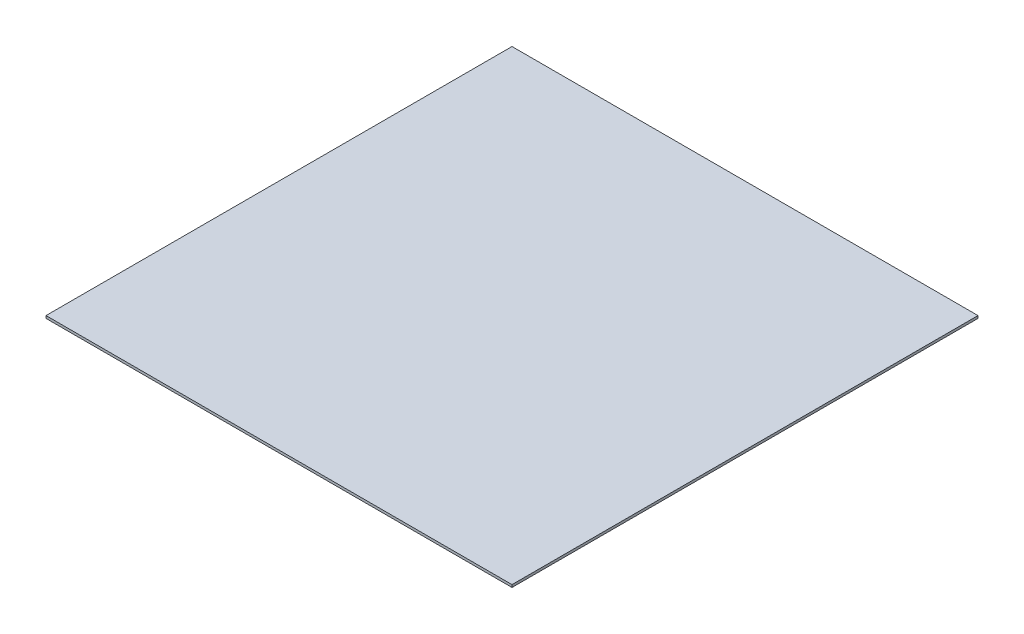
ISO-10303-21;
HEADER;
FILE_DESCRIPTION(('STEP AP214'),'2;1');
FILE_NAME('part.step','',(''),(''),'','','');
FILE_SCHEMA(('AUTOMOTIVE_DESIGN { 1 0 10303 214 1 1 1 1 }'));
ENDSEC;
DATA;
#1=APPLICATION_CONTEXT('core data for automotive mechanical design processes');
#2=APPLICATION_PROTOCOL_DEFINITION('international standard','automotive_design',2000,#1);
#3=PRODUCT_CONTEXT('',#1,'mechanical');
#4=PRODUCT('Part','Part','',(#3));
#5=PRODUCT_RELATED_PRODUCT_CATEGORY('part','',(#4));
#6=PRODUCT_DEFINITION_FORMATION('','',#4);
#7=PRODUCT_DEFINITION_CONTEXT('part definition',#1,'design');
#8=PRODUCT_DEFINITION('design','',#6,#7);
#9=PRODUCT_DEFINITION_SHAPE('','',#8);
#10=(LENGTH_UNIT() NAMED_UNIT(*) SI_UNIT(.MILLI.,.METRE.));
#11=(NAMED_UNIT(*) PLANE_ANGLE_UNIT() SI_UNIT($,.RADIAN.));
#12=(NAMED_UNIT(*) SI_UNIT($,.STERADIAN.) SOLID_ANGLE_UNIT());
#13=UNCERTAINTY_MEASURE_WITH_UNIT(LENGTH_MEASURE(1.E-05),#10,'distance_accuracy_value','');
#14=(GEOMETRIC_REPRESENTATION_CONTEXT(3) GLOBAL_UNCERTAINTY_ASSIGNED_CONTEXT((#13)) GLOBAL_UNIT_ASSIGNED_CONTEXT((#10,
#11,#12)) REPRESENTATION_CONTEXT('',''));
#15=CARTESIAN_POINT('',(0.,0.,0.));
#16=DIRECTION('',(0.,0.,1.));
#17=DIRECTION('',(1.,0.,0.));
#18=AXIS2_PLACEMENT_3D('',#15,#16,#17);
#19=CARTESIAN_POINT('',(0.,3.,0.));
#20=DIRECTION('',(1.,0.,0.));
#21=DIRECTION('',(0.,0.,-1.));
#22=AXIS2_PLACEMENT_3D('',#19,#20,#21);
#23=PLANE('',#22);
#24=DIRECTION('',(0.,0.,1.));
#25=VECTOR('',#24,1.);
#26=CARTESIAN_POINT('',(0.,0.,0.));
#27=LINE('',#26,#25);
#28=CARTESIAN_POINT('',(0.,0.,-560.));
#29=VERTEX_POINT('',#28);
#30=CARTESIAN_POINT('',(0.,0.,0.));
#31=VERTEX_POINT('',#30);
#32=EDGE_CURVE('E96',#29,#31,#27,.T.);
#33=ORIENTED_EDGE('',*,*,#32,.T.);
#34=DIRECTION('',(0.,-1.,0.));
#35=VECTOR('',#34,1.);
#36=CARTESIAN_POINT('',(0.,3.,0.));
#37=LINE('',#36,#35);
#38=CARTESIAN_POINT('',(0.,3.,0.));
#39=VERTEX_POINT('',#38);
#40=EDGE_CURVE('E11',#39,#31,#37,.T.);
#41=ORIENTED_EDGE('',*,*,#40,.F.);
#42=DIRECTION('',(0.,0.,1.));
#43=VECTOR('',#42,1.);
#44=CARTESIAN_POINT('',(0.,3.,0.));
#45=LINE('',#44,#43);
#46=CARTESIAN_POINT('',(0.,3.,-560.));
#47=VERTEX_POINT('',#46);
#48=EDGE_CURVE('E84',#47,#39,#45,.T.);
#49=ORIENTED_EDGE('',*,*,#48,.F.);
#50=DIRECTION('',(0.,-1.,0.));
#51=VECTOR('',#50,1.);
#52=CARTESIAN_POINT('',(0.,3.,-560.));
#53=LINE('',#52,#51);
#54=EDGE_CURVE('E92',#47,#29,#53,.T.);
#55=ORIENTED_EDGE('',*,*,#54,.T.);
#56=EDGE_LOOP('',(#33,#41,#49,#55));
#57=FACE_BOUND('',#56,.T.);
#58=ADVANCED_FACE('F33',(#57),#23,.F.);
#59=CARTESIAN_POINT('',(0.,3.,0.));
#60=DIRECTION('',(0.,0.,-1.));
#61=DIRECTION('',(-1.,0.,0.));
#62=AXIS2_PLACEMENT_3D('',#59,#60,#61);
#63=PLANE('',#62);
#64=DIRECTION('',(1.,0.,0.));
#65=VECTOR('',#64,1.);
#66=CARTESIAN_POINT('',(0.,0.,0.));
#67=LINE('',#66,#65);
#68=CARTESIAN_POINT('',(560.,0.,0.));
#69=VERTEX_POINT('',#68);
#70=EDGE_CURVE('E88',#31,#69,#67,.T.);
#71=ORIENTED_EDGE('',*,*,#70,.T.);
#72=DIRECTION('',(0.,-1.,0.));
#73=VECTOR('',#72,1.);
#74=CARTESIAN_POINT('',(560.,3.,0.));
#75=LINE('',#74,#73);
#76=CARTESIAN_POINT('',(560.,3.,0.));
#77=VERTEX_POINT('',#76);
#78=EDGE_CURVE('E41',#77,#69,#75,.T.);
#79=ORIENTED_EDGE('',*,*,#78,.F.);
#80=DIRECTION('',(1.,0.,0.));
#81=VECTOR('',#80,1.);
#82=CARTESIAN_POINT('',(0.,3.,0.));
#83=LINE('',#82,#81);
#84=EDGE_CURVE('E79',#39,#77,#83,.T.);
#85=ORIENTED_EDGE('',*,*,#84,.F.);
#86=ORIENTED_EDGE('',*,*,#40,.T.);
#87=EDGE_LOOP('',(#71,#79,#85,#86));
#88=FACE_BOUND('',#87,.T.);
#89=ADVANCED_FACE('F87',(#88),#63,.F.);
#90=CARTESIAN_POINT('',(560.,3.,0.));
#91=DIRECTION('',(-1.,0.,0.));
#92=DIRECTION('',(0.,0.,1.));
#93=AXIS2_PLACEMENT_3D('',#90,#91,#92);
#94=PLANE('',#93);
#95=DIRECTION('',(0.,0.,-1.));
#96=VECTOR('',#95,1.);
#97=CARTESIAN_POINT('',(560.,0.,0.));
#98=LINE('',#97,#96);
#99=CARTESIAN_POINT('',(560.,0.,-560.));
#100=VERTEX_POINT('',#99);
#101=EDGE_CURVE('E66',#69,#100,#98,.T.);
#102=ORIENTED_EDGE('',*,*,#101,.T.);
#103=DIRECTION('',(0.,-1.,0.));
#104=VECTOR('',#103,1.);
#105=CARTESIAN_POINT('',(560.,3.,-560.));
#106=LINE('',#105,#104);
#107=CARTESIAN_POINT('',(560.,3.,-560.));
#108=VERTEX_POINT('',#107);
#109=EDGE_CURVE('E89',#108,#100,#106,.T.);
#110=ORIENTED_EDGE('',*,*,#109,.F.);
#111=DIRECTION('',(0.,0.,-1.));
#112=VECTOR('',#111,1.);
#113=CARTESIAN_POINT('',(560.,3.,0.));
#114=LINE('',#113,#112);
#115=EDGE_CURVE('E82',#77,#108,#114,.T.);
#116=ORIENTED_EDGE('',*,*,#115,.F.);
#117=ORIENTED_EDGE('',*,*,#78,.T.);
#118=EDGE_LOOP('',(#102,#110,#116,#117));
#119=FACE_BOUND('',#118,.T.);
#120=ADVANCED_FACE('F90',(#119),#94,.F.);
#121=CARTESIAN_POINT('',(0.,3.,-560.));
#122=DIRECTION('',(0.,0.,1.));
#123=DIRECTION('',(1.,0.,0.));
#124=AXIS2_PLACEMENT_3D('',#121,#122,#123);
#125=PLANE('',#124);
#126=DIRECTION('',(-1.,0.,0.));
#127=VECTOR('',#126,1.);
#128=CARTESIAN_POINT('',(0.,0.,-560.));
#129=LINE('',#128,#127);
#130=EDGE_CURVE('E72',#100,#29,#129,.T.);
#131=ORIENTED_EDGE('',*,*,#130,.T.);
#132=ORIENTED_EDGE('',*,*,#54,.F.);
#133=DIRECTION('',(-1.,0.,0.));
#134=VECTOR('',#133,1.);
#135=CARTESIAN_POINT('',(0.,3.,-560.));
#136=LINE('',#135,#134);
#137=EDGE_CURVE('E49',#108,#47,#136,.T.);
#138=ORIENTED_EDGE('',*,*,#137,.F.);
#139=ORIENTED_EDGE('',*,*,#109,.T.);
#140=EDGE_LOOP('',(#131,#132,#138,#139));
#141=FACE_BOUND('',#140,.T.);
#142=ADVANCED_FACE('F103',(#141),#125,.F.);
#143=CARTESIAN_POINT('',(0.,3.,0.));
#144=DIRECTION('',(0.,-1.,0.));
#145=DIRECTION('',(0.,0.,-1.));
#146=AXIS2_PLACEMENT_3D('',#143,#144,#145);
#147=PLANE('',#146);
#148=ORIENTED_EDGE('',*,*,#48,.T.);
#149=ORIENTED_EDGE('',*,*,#84,.T.);
#150=ORIENTED_EDGE('',*,*,#115,.T.);
#151=ORIENTED_EDGE('',*,*,#137,.T.);
#152=EDGE_LOOP('',(#148,#149,#150,#151));
#153=FACE_BOUND('',#152,.T.);
#154=ADVANCED_FACE('F80',(#153),#147,.F.);
#155=CARTESIAN_POINT('',(0.,0.,0.));
#156=DIRECTION('',(0.,-1.,0.));
#157=DIRECTION('',(0.,0.,-1.));
#158=AXIS2_PLACEMENT_3D('',#155,#156,#157);
#159=PLANE('',#158);
#160=ORIENTED_EDGE('',*,*,#32,.F.);
#161=ORIENTED_EDGE('',*,*,#130,.F.);
#162=ORIENTED_EDGE('',*,*,#101,.F.);
#163=ORIENTED_EDGE('',*,*,#70,.F.);
#164=EDGE_LOOP('',(#160,#161,#162,#163));
#165=FACE_BOUND('',#164,.T.);
#166=ADVANCED_FACE('F106',(#165),#159,.T.);
#167=CLOSED_SHELL('',(#58,#89,#120,#142,#154,#166));
#168=MANIFOLD_SOLID_BREP('B2',#167);
#169=ADVANCED_BREP_SHAPE_REPRESENTATION('',(#18,#168),#14);
#170=SHAPE_DEFINITION_REPRESENTATION(#9,#169);
ENDSEC;
END-ISO-10303-21;
